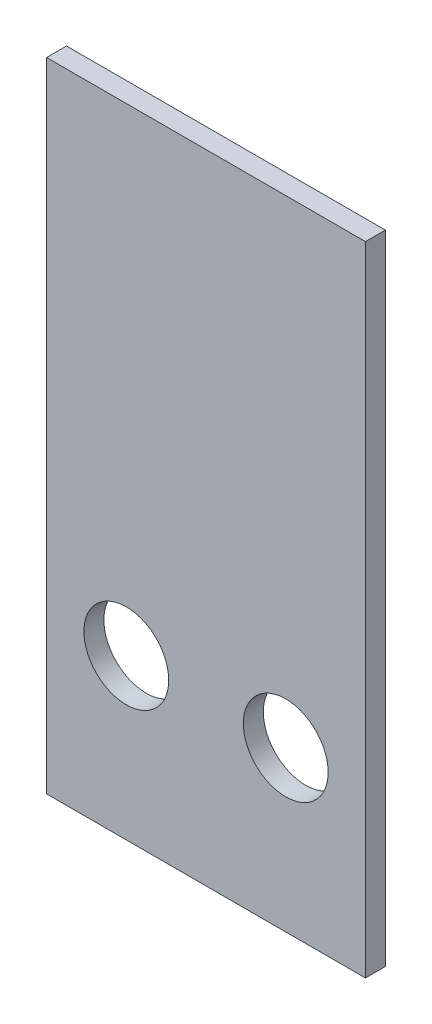
ISO-10303-21;
HEADER;
FILE_DESCRIPTION(('STEP AP214'),'2;1');
FILE_NAME('part.step','',(''),(''),'','','');
FILE_SCHEMA(('AUTOMOTIVE_DESIGN { 1 0 10303 214 1 1 1 1 }'));
ENDSEC;
DATA;
#1=APPLICATION_CONTEXT('core data for automotive mechanical design processes');
#2=APPLICATION_PROTOCOL_DEFINITION('international standard','automotive_design',2000,#1);
#3=PRODUCT_CONTEXT('',#1,'mechanical');
#4=PRODUCT('Part','Part','',(#3));
#5=PRODUCT_RELATED_PRODUCT_CATEGORY('part','',(#4));
#6=PRODUCT_DEFINITION_FORMATION('','',#4);
#7=PRODUCT_DEFINITION_CONTEXT('part definition',#1,'design');
#8=PRODUCT_DEFINITION('design','',#6,#7);
#9=PRODUCT_DEFINITION_SHAPE('','',#8);
#10=(LENGTH_UNIT() NAMED_UNIT(*) SI_UNIT(.MILLI.,.METRE.));
#11=(NAMED_UNIT(*) PLANE_ANGLE_UNIT() SI_UNIT($,.RADIAN.));
#12=(NAMED_UNIT(*) SI_UNIT($,.STERADIAN.) SOLID_ANGLE_UNIT());
#13=UNCERTAINTY_MEASURE_WITH_UNIT(LENGTH_MEASURE(1.E-05),#10,'distance_accuracy_value','');
#14=(GEOMETRIC_REPRESENTATION_CONTEXT(3) GLOBAL_UNCERTAINTY_ASSIGNED_CONTEXT((#13)) GLOBAL_UNIT_ASSIGNED_CONTEXT((#10,
#11,#12)) REPRESENTATION_CONTEXT('',''));
#15=CARTESIAN_POINT('',(0.,0.,0.));
#16=DIRECTION('',(0.,0.,1.));
#17=DIRECTION('',(1.,0.,0.));
#18=AXIS2_PLACEMENT_3D('',#15,#16,#17);
#19=CARTESIAN_POINT('',(12.7,25.4,1.5875));
#20=DIRECTION('',(-1.,0.,0.));
#21=DIRECTION('',(0.,-1.,0.));
#22=AXIS2_PLACEMENT_3D('',#19,#20,#21);
#23=PLANE('',#22);
#24=DIRECTION('',(0.,1.,0.));
#25=VECTOR('',#24,1.);
#26=CARTESIAN_POINT('',(12.7,25.4,0.));
#27=LINE('',#26,#25);
#28=CARTESIAN_POINT('',(12.7,-25.4,0.));
#29=VERTEX_POINT('',#28);
#30=CARTESIAN_POINT('',(12.7,25.4,0.));
#31=VERTEX_POINT('',#30);
#32=EDGE_CURVE('E96',#29,#31,#27,.T.);
#33=ORIENTED_EDGE('',*,*,#32,.T.);
#34=DIRECTION('',(0.,0.,-1.));
#35=VECTOR('',#34,1.);
#36=CARTESIAN_POINT('',(12.7,25.4,1.5875));
#37=LINE('',#36,#35);
#38=CARTESIAN_POINT('',(12.7,25.4,1.5875));
#39=VERTEX_POINT('',#38);
#40=EDGE_CURVE('E11',#39,#31,#37,.T.);
#41=ORIENTED_EDGE('',*,*,#40,.F.);
#42=DIRECTION('',(0.,1.,0.));
#43=VECTOR('',#42,1.);
#44=CARTESIAN_POINT('',(12.7,25.4,1.5875));
#45=LINE('',#44,#43);
#46=CARTESIAN_POINT('',(12.7,-25.4,1.5875));
#47=VERTEX_POINT('',#46);
#48=EDGE_CURVE('E84',#47,#39,#45,.T.);
#49=ORIENTED_EDGE('',*,*,#48,.F.);
#50=DIRECTION('',(0.,0.,-1.));
#51=VECTOR('',#50,1.);
#52=CARTESIAN_POINT('',(12.7,-25.4,1.5875));
#53=LINE('',#52,#51);
#54=EDGE_CURVE('E92',#47,#29,#53,.T.);
#55=ORIENTED_EDGE('',*,*,#54,.T.);
#56=EDGE_LOOP('',(#33,#41,#49,#55));
#57=FACE_BOUND('',#56,.T.);
#58=ADVANCED_FACE('F33',(#57),#23,.F.);
#59=CARTESIAN_POINT('',(-12.7,25.4,1.5875));
#60=DIRECTION('',(0.,-1.,0.));
#61=DIRECTION('',(0.,0.,-1.));
#62=AXIS2_PLACEMENT_3D('',#59,#60,#61);
#63=PLANE('',#62);
#64=DIRECTION('',(-1.,0.,0.));
#65=VECTOR('',#64,1.);
#66=CARTESIAN_POINT('',(-12.7,25.4,0.));
#67=LINE('',#66,#65);
#68=CARTESIAN_POINT('',(-12.7,25.4,0.));
#69=VERTEX_POINT('',#68);
#70=EDGE_CURVE('E88',#31,#69,#67,.T.);
#71=ORIENTED_EDGE('',*,*,#70,.T.);
#72=DIRECTION('',(0.,0.,-1.));
#73=VECTOR('',#72,1.);
#74=CARTESIAN_POINT('',(-12.7,25.4,1.5875));
#75=LINE('',#74,#73);
#76=CARTESIAN_POINT('',(-12.7,25.4,1.5875));
#77=VERTEX_POINT('',#76);
#78=EDGE_CURVE('E41',#77,#69,#75,.T.);
#79=ORIENTED_EDGE('',*,*,#78,.F.);
#80=DIRECTION('',(-1.,0.,0.));
#81=VECTOR('',#80,1.);
#82=CARTESIAN_POINT('',(-12.7,25.4,1.5875));
#83=LINE('',#82,#81);
#84=EDGE_CURVE('E79',#39,#77,#83,.T.);
#85=ORIENTED_EDGE('',*,*,#84,.F.);
#86=ORIENTED_EDGE('',*,*,#40,.T.);
#87=EDGE_LOOP('',(#71,#79,#85,#86));
#88=FACE_BOUND('',#87,.T.);
#89=ADVANCED_FACE('F87',(#88),#63,.F.);
#90=CARTESIAN_POINT('',(-12.7,25.4,1.5875));
#91=DIRECTION('',(1.,0.,0.));
#92=DIRECTION('',(0.,1.,0.));
#93=AXIS2_PLACEMENT_3D('',#90,#91,#92);
#94=PLANE('',#93);
#95=DIRECTION('',(0.,-1.,0.));
#96=VECTOR('',#95,1.);
#97=CARTESIAN_POINT('',(-12.7,25.4,0.));
#98=LINE('',#97,#96);
#99=CARTESIAN_POINT('',(-12.7,-25.4,0.));
#100=VERTEX_POINT('',#99);
#101=EDGE_CURVE('E66',#69,#100,#98,.T.);
#102=ORIENTED_EDGE('',*,*,#101,.T.);
#103=DIRECTION('',(0.,0.,-1.));
#104=VECTOR('',#103,1.);
#105=CARTESIAN_POINT('',(-12.7,-25.4,1.5875));
#106=LINE('',#105,#104);
#107=CARTESIAN_POINT('',(-12.7,-25.4,1.5875));
#108=VERTEX_POINT('',#107);
#109=EDGE_CURVE('E89',#108,#100,#106,.T.);
#110=ORIENTED_EDGE('',*,*,#109,.F.);
#111=DIRECTION('',(0.,-1.,0.));
#112=VECTOR('',#111,1.);
#113=CARTESIAN_POINT('',(-12.7,25.4,1.5875));
#114=LINE('',#113,#112);
#115=EDGE_CURVE('E82',#77,#108,#114,.T.);
#116=ORIENTED_EDGE('',*,*,#115,.F.);
#117=ORIENTED_EDGE('',*,*,#78,.T.);
#118=EDGE_LOOP('',(#102,#110,#116,#117));
#119=FACE_BOUND('',#118,.T.);
#120=ADVANCED_FACE('F90',(#119),#94,.F.);
#121=CARTESIAN_POINT('',(-12.7,-25.4,1.5875));
#122=DIRECTION('',(0.,1.,0.));
#123=DIRECTION('',(0.,0.,1.));
#124=AXIS2_PLACEMENT_3D('',#121,#122,#123);
#125=PLANE('',#124);
#126=DIRECTION('',(1.,0.,0.));
#127=VECTOR('',#126,1.);
#128=CARTESIAN_POINT('',(-12.7,-25.4,0.));
#129=LINE('',#128,#127);
#130=EDGE_CURVE('E72',#100,#29,#129,.T.);
#131=ORIENTED_EDGE('',*,*,#130,.T.);
#132=ORIENTED_EDGE('',*,*,#54,.F.);
#133=DIRECTION('',(1.,0.,0.));
#134=VECTOR('',#133,1.);
#135=CARTESIAN_POINT('',(-12.7,-25.4,1.5875));
#136=LINE('',#135,#134);
#137=EDGE_CURVE('E49',#108,#47,#136,.T.);
#138=ORIENTED_EDGE('',*,*,#137,.F.);
#139=ORIENTED_EDGE('',*,*,#109,.T.);
#140=EDGE_LOOP('',(#131,#132,#138,#139));
#141=FACE_BOUND('',#140,.T.);
#142=ADVANCED_FACE('F104',(#141),#125,.F.);
#143=CARTESIAN_POINT('',(0.,0.,1.5875));
#144=DIRECTION('',(0.,0.,1.));
#145=DIRECTION('',(1.,0.,0.));
#146=AXIS2_PLACEMENT_3D('',#143,#144,#145);
#147=PLANE('',#146);
#148=CARTESIAN_POINT('',(-6.35,-12.7,1.5875));
#149=DIRECTION('',(0.,0.,1.));
#150=DIRECTION('',(1.,0.,0.));
#151=AXIS2_PLACEMENT_3D('',#148,#149,#150);
#152=CIRCLE('',#151,3.37819999999999);
#153=CARTESIAN_POINT('',(-2.97180000000001,-12.7,1.5875));
#154=VERTEX_POINT('',#153);
#155=EDGE_CURVE('E118',#154,#154,#152,.T.);
#156=ORIENTED_EDGE('',*,*,#155,.F.);
#157=EDGE_LOOP('',(#156));
#158=FACE_BOUND('',#157,.T.);
#159=CARTESIAN_POINT('',(6.35,-12.7,1.5875));
#160=DIRECTION('',(0.,0.,1.));
#161=DIRECTION('',(1.,0.,0.));
#162=AXIS2_PLACEMENT_3D('',#159,#160,#161);
#163=CIRCLE('',#162,3.37819999999999);
#164=CARTESIAN_POINT('',(9.72819999999999,-12.7,1.5875));
#165=VERTEX_POINT('',#164);
#166=EDGE_CURVE('E112',#165,#165,#163,.T.);
#167=ORIENTED_EDGE('',*,*,#166,.F.);
#168=EDGE_LOOP('',(#167));
#169=FACE_BOUND('',#168,.T.);
#170=ORIENTED_EDGE('',*,*,#48,.T.);
#171=ORIENTED_EDGE('',*,*,#84,.T.);
#172=ORIENTED_EDGE('',*,*,#115,.T.);
#173=ORIENTED_EDGE('',*,*,#137,.T.);
#174=EDGE_LOOP('',(#170,#171,#172,#173));
#175=FACE_BOUND('',#174,.T.);
#176=ADVANCED_FACE('F80',(#158,#169,#175),#147,.T.);
#177=CARTESIAN_POINT('',(0.,0.,0.));
#178=DIRECTION('',(0.,0.,1.));
#179=DIRECTION('',(1.,0.,0.));
#180=AXIS2_PLACEMENT_3D('',#177,#178,#179);
#181=PLANE('',#180);
#182=CARTESIAN_POINT('',(-6.35,-12.7,0.));
#183=DIRECTION('',(0.,0.,1.));
#184=DIRECTION('',(1.,0.,0.));
#185=AXIS2_PLACEMENT_3D('',#182,#183,#184);
#186=CIRCLE('',#185,3.3782);
#187=CARTESIAN_POINT('',(-2.9718,-12.7,0.));
#188=VERTEX_POINT('',#187);
#189=EDGE_CURVE('E115',#188,#188,#186,.T.);
#190=ORIENTED_EDGE('',*,*,#189,.T.);
#191=EDGE_LOOP('',(#190));
#192=FACE_BOUND('',#191,.T.);
#193=CARTESIAN_POINT('',(6.35,-12.7,0.));
#194=DIRECTION('',(0.,0.,1.));
#195=DIRECTION('',(1.,0.,0.));
#196=AXIS2_PLACEMENT_3D('',#193,#194,#195);
#197=CIRCLE('',#196,3.3782);
#198=CARTESIAN_POINT('',(9.7282,-12.7,0.));
#199=VERTEX_POINT('',#198);
#200=EDGE_CURVE('E99',#199,#199,#197,.T.);
#201=ORIENTED_EDGE('',*,*,#200,.T.);
#202=EDGE_LOOP('',(#201));
#203=FACE_BOUND('',#202,.T.);
#204=ORIENTED_EDGE('',*,*,#32,.F.);
#205=ORIENTED_EDGE('',*,*,#130,.F.);
#206=ORIENTED_EDGE('',*,*,#101,.F.);
#207=ORIENTED_EDGE('',*,*,#70,.F.);
#208=EDGE_LOOP('',(#204,#205,#206,#207));
#209=FACE_BOUND('',#208,.T.);
#210=ADVANCED_FACE('F107',(#192,#203,#209),#181,.F.);
#211=CARTESIAN_POINT('',(6.35,-12.7,1.5875));
#212=DIRECTION('',(0.,0.,1.));
#213=DIRECTION('',(1.,0.,0.));
#214=AXIS2_PLACEMENT_3D('',#211,#212,#213);
#215=CYLINDRICAL_SURFACE('',#214,3.37819999999999);
#216=ORIENTED_EDGE('',*,*,#200,.F.);
#217=EDGE_LOOP('',(#216));
#218=FACE_BOUND('',#217,.T.);
#219=ORIENTED_EDGE('',*,*,#166,.T.);
#220=EDGE_LOOP('',(#219));
#221=FACE_BOUND('',#220,.T.);
#222=ADVANCED_FACE('F129',(#218,#221),#215,.F.);
#223=CARTESIAN_POINT('',(-6.35,-12.7,1.5875));
#224=DIRECTION('',(0.,0.,1.));
#225=DIRECTION('',(1.,0.,0.));
#226=AXIS2_PLACEMENT_3D('',#223,#224,#225);
#227=CYLINDRICAL_SURFACE('',#226,3.37819999999999);
#228=ORIENTED_EDGE('',*,*,#189,.F.);
#229=EDGE_LOOP('',(#228));
#230=FACE_BOUND('',#229,.T.);
#231=ORIENTED_EDGE('',*,*,#155,.T.);
#232=EDGE_LOOP('',(#231));
#233=FACE_BOUND('',#232,.T.);
#234=ADVANCED_FACE('F122',(#230,#233),#227,.F.);
#235=CLOSED_SHELL('',(#58,#89,#120,#142,#176,#210,#222,#234));
#236=MANIFOLD_SOLID_BREP('B2',#235);
#237=ADVANCED_BREP_SHAPE_REPRESENTATION('',(#18,#236),#14);
#238=SHAPE_DEFINITION_REPRESENTATION(#9,#237);
ENDSEC;
END-ISO-10303-21;
